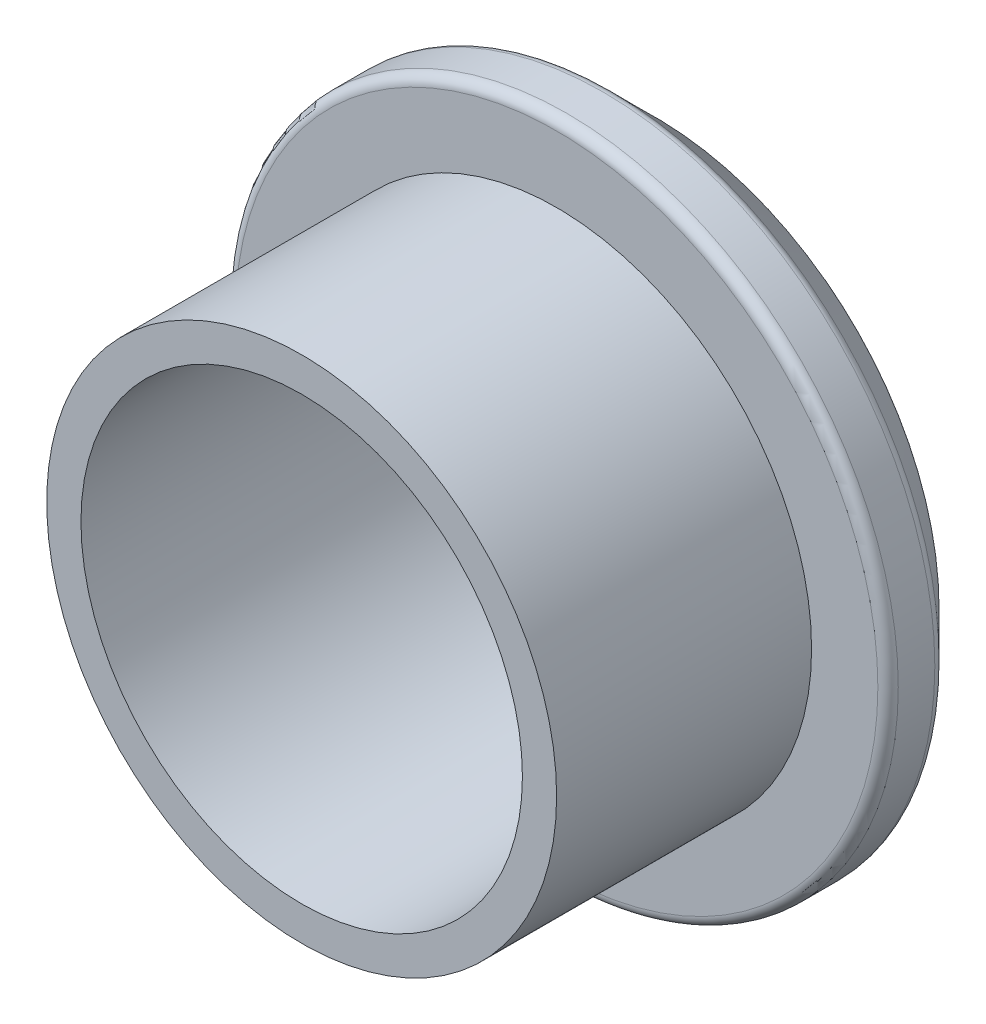
ISO-10303-21;
HEADER;
FILE_DESCRIPTION(('STEP AP214'),'2;1');
FILE_NAME('part.step','',(''),(''),'','','');
FILE_SCHEMA(('AUTOMOTIVE_DESIGN { 1 0 10303 214 1 1 1 1 }'));
ENDSEC;
DATA;
#1=APPLICATION_CONTEXT('core data for automotive mechanical design processes');
#2=APPLICATION_PROTOCOL_DEFINITION('international standard','automotive_design',2000,#1);
#3=PRODUCT_CONTEXT('',#1,'mechanical');
#4=PRODUCT('Part','Part','',(#3));
#5=PRODUCT_RELATED_PRODUCT_CATEGORY('part','',(#4));
#6=PRODUCT_DEFINITION_FORMATION('','',#4);
#7=PRODUCT_DEFINITION_CONTEXT('part definition',#1,'design');
#8=PRODUCT_DEFINITION('design','',#6,#7);
#9=PRODUCT_DEFINITION_SHAPE('','',#8);
#10=(LENGTH_UNIT() NAMED_UNIT(*) SI_UNIT(.MILLI.,.METRE.));
#11=(NAMED_UNIT(*) PLANE_ANGLE_UNIT() SI_UNIT($,.RADIAN.));
#12=(NAMED_UNIT(*) SI_UNIT($,.STERADIAN.) SOLID_ANGLE_UNIT());
#13=UNCERTAINTY_MEASURE_WITH_UNIT(LENGTH_MEASURE(1.E-05),#10,'distance_accuracy_value','');
#14=(GEOMETRIC_REPRESENTATION_CONTEXT(3) GLOBAL_UNCERTAINTY_ASSIGNED_CONTEXT((#13)) GLOBAL_UNIT_ASSIGNED_CONTEXT((#10,
#11,#12)) REPRESENTATION_CONTEXT('',''));
#15=CARTESIAN_POINT('',(0.,0.,0.));
#16=DIRECTION('',(0.,0.,1.));
#17=DIRECTION('',(1.,0.,0.));
#18=AXIS2_PLACEMENT_3D('',#15,#16,#17);
#19=CARTESIAN_POINT('',(0.,0.,10.));
#20=DIRECTION('',(0.,0.,-1.));
#21=DIRECTION('',(-1.,0.,0.));
#22=AXIS2_PLACEMENT_3D('',#19,#20,#21);
#23=CYLINDRICAL_SURFACE('',#22,8.6579140192137);
#24=CARTESIAN_POINT('',(0.,0.,-3.6));
#25=DIRECTION('',(0.,0.,1.));
#26=DIRECTION('',(1.,0.,0.));
#27=AXIS2_PLACEMENT_3D('',#24,#25,#26);
#28=CIRCLE('',#27,8.6579140192137);
#29=CARTESIAN_POINT('',(8.6579140192137,0.,-3.6));
#30=VERTEX_POINT('',#29);
#31=EDGE_CURVE('E61',#30,#30,#28,.F.);
#32=ORIENTED_EDGE('',*,*,#31,.T.);
#33=EDGE_LOOP('',(#32));
#34=FACE_BOUND('',#33,.T.);
#35=CARTESIAN_POINT('',(0.,0.,10.));
#36=DIRECTION('',(0.,0.,1.));
#37=DIRECTION('',(1.,0.,0.));
#38=AXIS2_PLACEMENT_3D('',#35,#36,#37);
#39=CIRCLE('',#38,8.6579140192137);
#40=CARTESIAN_POINT('',(8.6579140192137,0.,10.));
#41=VERTEX_POINT('',#40);
#42=EDGE_CURVE('E73',#41,#41,#39,.T.);
#43=ORIENTED_EDGE('',*,*,#42,.T.);
#44=EDGE_LOOP('',(#43));
#45=FACE_BOUND('',#44,.T.);
#46=ADVANCED_FACE('F39',(#34,#45),#23,.F.);
#47=CARTESIAN_POINT('',(0.,0.,10.));
#48=DIRECTION('',(0.,0.,-1.));
#49=DIRECTION('',(-1.,0.,0.));
#50=AXIS2_PLACEMENT_3D('',#47,#48,#49);
#51=CYLINDRICAL_SURFACE('',#50,10.);
#52=CARTESIAN_POINT('',(0.,0.,10.));
#53=DIRECTION('',(0.,0.,1.));
#54=DIRECTION('',(1.,0.,0.));
#55=AXIS2_PLACEMENT_3D('',#52,#53,#54);
#56=CIRCLE('',#55,10.);
#57=CARTESIAN_POINT('',(10.,0.,10.));
#58=VERTEX_POINT('',#57);
#59=EDGE_CURVE('E72',#58,#58,#56,.T.);
#60=ORIENTED_EDGE('',*,*,#59,.F.);
#61=EDGE_LOOP('',(#60));
#62=FACE_BOUND('',#61,.T.);
#63=CARTESIAN_POINT('',(0.,0.,0.));
#64=DIRECTION('',(0.,0.,1.));
#65=DIRECTION('',(1.,0.,0.));
#66=AXIS2_PLACEMENT_3D('',#63,#64,#65);
#67=CIRCLE('',#66,10.);
#68=CARTESIAN_POINT('',(10.,0.,0.));
#69=VERTEX_POINT('',#68);
#70=EDGE_CURVE('E75',#69,#69,#67,.T.);
#71=ORIENTED_EDGE('',*,*,#70,.T.);
#72=EDGE_LOOP('',(#71));
#73=FACE_BOUND('',#72,.T.);
#74=ADVANCED_FACE('F88',(#62,#73),#51,.T.);
#75=CARTESIAN_POINT('',(0.,0.,10.));
#76=DIRECTION('',(0.,0.,1.));
#77=DIRECTION('',(1.,0.,0.));
#78=AXIS2_PLACEMENT_3D('',#75,#76,#77);
#79=PLANE('',#78);
#80=ORIENTED_EDGE('',*,*,#42,.F.);
#81=EDGE_LOOP('',(#80));
#82=FACE_BOUND('',#81,.T.);
#83=ORIENTED_EDGE('',*,*,#59,.T.);
#84=EDGE_LOOP('',(#83));
#85=FACE_BOUND('',#84,.T.);
#86=ADVANCED_FACE('F85',(#82,#85),#79,.T.);
#87=CARTESIAN_POINT('',(0.,0.,-4.));
#88=DIRECTION('',(0.,0.,1.));
#89=DIRECTION('',(1.,0.,0.));
#90=AXIS2_PLACEMENT_3D('',#87,#88,#89);
#91=CYLINDRICAL_SURFACE('',#90,13.);
#92=CARTESIAN_POINT('',(0.,0.,-0.4));
#93=DIRECTION('',(0.,0.,1.));
#94=DIRECTION('',(1.,0.,0.));
#95=AXIS2_PLACEMENT_3D('',#92,#93,#94);
#96=CIRCLE('',#95,13.);
#97=CARTESIAN_POINT('',(13.,0.,-0.4));
#98=VERTEX_POINT('',#97);
#99=EDGE_CURVE('E10',#98,#98,#96,.F.);
#100=ORIENTED_EDGE('',*,*,#99,.T.);
#101=EDGE_LOOP('',(#100));
#102=FACE_BOUND('',#101,.T.);
#103=CARTESIAN_POINT('',(0.,0.,-1.83431457505076));
#104=DIRECTION('',(0.,0.,-1.));
#105=DIRECTION('',(-1.,0.,0.));
#106=AXIS2_PLACEMENT_3D('',#103,#104,#105);
#107=CIRCLE('',#106,13.);
#108=CARTESIAN_POINT('',(-13.,0.,-1.83431457505076));
#109=VERTEX_POINT('',#108);
#110=EDGE_CURVE('E64',#109,#109,#107,.F.);
#111=ORIENTED_EDGE('',*,*,#110,.T.);
#112=EDGE_LOOP('',(#111));
#113=FACE_BOUND('',#112,.T.);
#114=ADVANCED_FACE('F81',(#102,#113),#91,.T.);
#115=CARTESIAN_POINT('',(0.,0.,-4.));
#116=DIRECTION('',(0.,0.,1.));
#117=DIRECTION('',(1.,0.,0.));
#118=AXIS2_PLACEMENT_3D('',#115,#116,#117);
#119=PLANE('',#118);
#120=CARTESIAN_POINT('',(0.,0.,-4.));
#121=DIRECTION('',(0.,0.,1.));
#122=DIRECTION('',(1.,0.,0.));
#123=AXIS2_PLACEMENT_3D('',#120,#121,#122);
#124=CIRCLE('',#123,10.8343145750508);
#125=CARTESIAN_POINT('',(10.8343145750508,0.,-4.));
#126=VERTEX_POINT('',#125);
#127=EDGE_CURVE('E49',#126,#126,#124,.F.);
#128=ORIENTED_EDGE('',*,*,#127,.T.);
#129=EDGE_LOOP('',(#128));
#130=FACE_BOUND('',#129,.T.);
#131=CARTESIAN_POINT('',(0.,0.,-4.));
#132=DIRECTION('',(0.,0.,1.));
#133=DIRECTION('',(1.,0.,0.));
#134=AXIS2_PLACEMENT_3D('',#131,#132,#133);
#135=CIRCLE('',#134,9.0579140192137);
#136=CARTESIAN_POINT('',(9.0579140192137,0.,-4.));
#137=VERTEX_POINT('',#136);
#138=EDGE_CURVE('E68',#137,#137,#135,.T.);
#139=ORIENTED_EDGE('',*,*,#138,.T.);
#140=EDGE_LOOP('',(#139));
#141=FACE_BOUND('',#140,.T.);
#142=ADVANCED_FACE('F98',(#130,#141),#119,.F.);
#143=CARTESIAN_POINT('',(0.,0.,0.));
#144=DIRECTION('',(0.,0.,1.));
#145=DIRECTION('',(1.,0.,0.));
#146=AXIS2_PLACEMENT_3D('',#143,#144,#145);
#147=PLANE('',#146);
#148=CARTESIAN_POINT('',(0.,0.,0.));
#149=DIRECTION('',(0.,0.,1.));
#150=DIRECTION('',(1.,0.,0.));
#151=AXIS2_PLACEMENT_3D('',#148,#149,#150);
#152=CIRCLE('',#151,12.6);
#153=CARTESIAN_POINT('',(12.6,0.,0.));
#154=VERTEX_POINT('',#153);
#155=EDGE_CURVE('E46',#154,#154,#152,.T.);
#156=ORIENTED_EDGE('',*,*,#155,.T.);
#157=EDGE_LOOP('',(#156));
#158=FACE_BOUND('',#157,.T.);
#159=ORIENTED_EDGE('',*,*,#70,.F.);
#160=EDGE_LOOP('',(#159));
#161=FACE_BOUND('',#160,.T.);
#162=ADVANCED_FACE('F92',(#158,#161),#147,.T.);
#163=CARTESIAN_POINT('',(0.,0.,-2.));
#164=DIRECTION('',(0.,0.,1.));
#165=DIRECTION('',(1.,0.,0.));
#166=AXIS2_PLACEMENT_3D('',#163,#164,#165);
#167=CONICAL_SURFACE('',#166,13.,0.78539816339745);
#168=CARTESIAN_POINT('',(0.,0.,-2.11715728752538));
#169=DIRECTION('',(0.,0.,-1.));
#170=DIRECTION('',(-1.,0.,0.));
#171=AXIS2_PLACEMENT_3D('',#168,#169,#170);
#172=CIRCLE('',#171,12.8828427124746);
#173=CARTESIAN_POINT('',(-12.8828427124746,0.,-2.11715728752538));
#174=VERTEX_POINT('',#173);
#175=EDGE_CURVE('E53',#174,#174,#172,.T.);
#176=ORIENTED_EDGE('',*,*,#175,.T.);
#177=EDGE_LOOP('',(#176));
#178=FACE_BOUND('',#177,.T.);
#179=CARTESIAN_POINT('',(0.,0.,-3.88284271247462));
#180=DIRECTION('',(0.,0.,1.));
#181=DIRECTION('',(1.,0.,0.));
#182=AXIS2_PLACEMENT_3D('',#179,#180,#181);
#183=CIRCLE('',#182,11.1171572875254);
#184=CARTESIAN_POINT('',(11.1171572875254,0.,-3.88284271247462));
#185=VERTEX_POINT('',#184);
#186=EDGE_CURVE('E56',#185,#185,#183,.T.);
#187=ORIENTED_EDGE('',*,*,#186,.T.);
#188=EDGE_LOOP('',(#187));
#189=FACE_BOUND('',#188,.T.);
#190=ADVANCED_FACE('F100',(#178,#189),#167,.T.);
#191=CARTESIAN_POINT('',(0.,0.,-3.6));
#192=DIRECTION('',(0.,0.,1.));
#193=DIRECTION('',(1.,0.,0.));
#194=AXIS2_PLACEMENT_3D('',#191,#192,#193);
#195=TOROIDAL_SURFACE('',#194,9.0579140192137,0.4);
#196=ORIENTED_EDGE('',*,*,#31,.F.);
#197=EDGE_LOOP('',(#196));
#198=FACE_BOUND('',#197,.T.);
#199=ORIENTED_EDGE('',*,*,#138,.F.);
#200=EDGE_LOOP('',(#199));
#201=FACE_BOUND('',#200,.T.);
#202=ADVANCED_FACE('F104',(#198,#201),#195,.T.);
#203=CARTESIAN_POINT('',(0.,0.,-1.83431457505076));
#204=DIRECTION('',(0.,0.,-1.));
#205=DIRECTION('',(-1.,0.,0.));
#206=AXIS2_PLACEMENT_3D('',#203,#204,#205);
#207=TOROIDAL_SURFACE('',#206,12.6,0.4);
#208=ORIENTED_EDGE('',*,*,#175,.F.);
#209=EDGE_LOOP('',(#208));
#210=FACE_BOUND('',#209,.T.);
#211=ORIENTED_EDGE('',*,*,#110,.F.);
#212=EDGE_LOOP('',(#211));
#213=FACE_BOUND('',#212,.T.);
#214=ADVANCED_FACE('F123',(#210,#213),#207,.T.);
#215=CARTESIAN_POINT('',(0.,0.,-3.6));
#216=DIRECTION('',(0.,0.,1.));
#217=DIRECTION('',(1.,0.,0.));
#218=AXIS2_PLACEMENT_3D('',#215,#216,#217);
#219=TOROIDAL_SURFACE('',#218,10.8343145750508,0.4);
#220=ORIENTED_EDGE('',*,*,#186,.F.);
#221=EDGE_LOOP('',(#220));
#222=FACE_BOUND('',#221,.T.);
#223=ORIENTED_EDGE('',*,*,#127,.F.);
#224=EDGE_LOOP('',(#223));
#225=FACE_BOUND('',#224,.T.);
#226=ADVANCED_FACE('F127',(#222,#225),#219,.T.);
#227=CARTESIAN_POINT('',(0.,0.,-0.4));
#228=DIRECTION('',(0.,0.,1.));
#229=DIRECTION('',(1.,0.,0.));
#230=AXIS2_PLACEMENT_3D('',#227,#228,#229);
#231=TOROIDAL_SURFACE('',#230,12.6,0.4);
#232=ORIENTED_EDGE('',*,*,#99,.F.);
#233=EDGE_LOOP('',(#232));
#234=FACE_BOUND('',#233,.T.);
#235=ORIENTED_EDGE('',*,*,#155,.F.);
#236=EDGE_LOOP('',(#235));
#237=FACE_BOUND('',#236,.T.);
#238=ADVANCED_FACE('F41',(#234,#237),#231,.T.);
#239=CLOSED_SHELL('',(#46,#74,#86,#114,#142,#162,#190,#202,#214,#226,#238));
#240=MANIFOLD_SOLID_BREP('B2',#239);
#241=ADVANCED_BREP_SHAPE_REPRESENTATION('',(#18,#240),#14);
#242=SHAPE_DEFINITION_REPRESENTATION(#9,#241);
ENDSEC;
END-ISO-10303-21;
